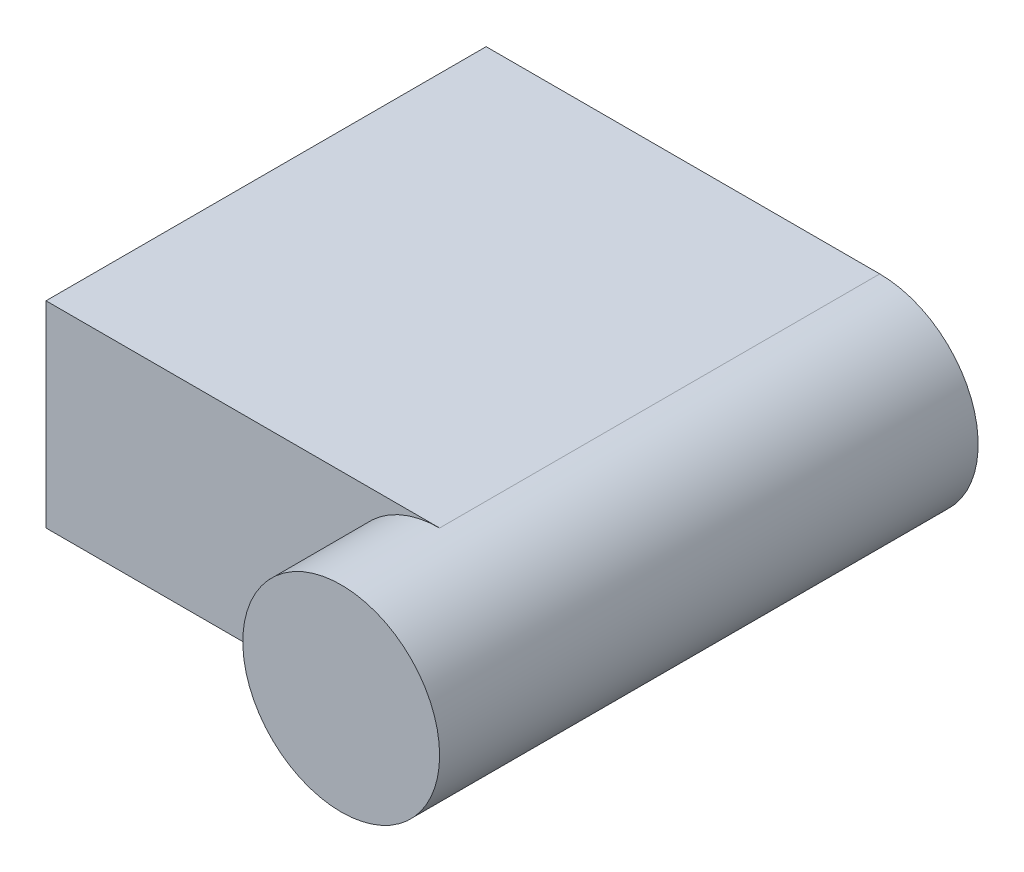
ISO-10303-21;
HEADER;
FILE_DESCRIPTION(('STEP AP214'),'2;1');
FILE_NAME('part.step','',(''),(''),'','','');
FILE_SCHEMA(('AUTOMOTIVE_DESIGN { 1 0 10303 214 1 1 1 1 }'));
ENDSEC;
DATA;
#1=APPLICATION_CONTEXT('core data for automotive mechanical design processes');
#2=APPLICATION_PROTOCOL_DEFINITION('international standard','automotive_design',2000,#1);
#3=PRODUCT_CONTEXT('',#1,'mechanical');
#4=PRODUCT('Part','Part','',(#3));
#5=PRODUCT_RELATED_PRODUCT_CATEGORY('part','',(#4));
#6=PRODUCT_DEFINITION_FORMATION('','',#4);
#7=PRODUCT_DEFINITION_CONTEXT('part definition',#1,'design');
#8=PRODUCT_DEFINITION('design','',#6,#7);
#9=PRODUCT_DEFINITION_SHAPE('','',#8);
#10=(LENGTH_UNIT() NAMED_UNIT(*) SI_UNIT(.MILLI.,.METRE.));
#11=(NAMED_UNIT(*) PLANE_ANGLE_UNIT() SI_UNIT($,.RADIAN.));
#12=(NAMED_UNIT(*) SI_UNIT($,.STERADIAN.) SOLID_ANGLE_UNIT());
#13=UNCERTAINTY_MEASURE_WITH_UNIT(LENGTH_MEASURE(1.E-05),#10,'distance_accuracy_value','');
#14=(GEOMETRIC_REPRESENTATION_CONTEXT(3) GLOBAL_UNCERTAINTY_ASSIGNED_CONTEXT((#13)) GLOBAL_UNIT_ASSIGNED_CONTEXT((#10,
#11,#12)) REPRESENTATION_CONTEXT('',''));
#15=CARTESIAN_POINT('',(0.,0.,0.));
#16=DIRECTION('',(0.,0.,1.));
#17=DIRECTION('',(1.,0.,0.));
#18=AXIS2_PLACEMENT_3D('',#15,#16,#17);
#19=CARTESIAN_POINT('',(0.,0.,44.73));
#20=DIRECTION('',(0.,1.,0.));
#21=DIRECTION('',(0.,0.,1.));
#22=AXIS2_PLACEMENT_3D('',#19,#20,#21);
#23=PLANE('',#22);
#24=DIRECTION('',(0.,0.,1.));
#25=VECTOR('',#24,1.);
#26=CARTESIAN_POINT('',(40.,0.,-63.2455532033676));
#27=LINE('',#26,#25);
#28=CARTESIAN_POINT('',(40.,0.,0.));
#29=VERTEX_POINT('',#28);
#30=CARTESIAN_POINT('',(40.,0.,44.73));
#31=VERTEX_POINT('',#30);
#32=EDGE_CURVE('E93',#29,#31,#27,.T.);
#33=ORIENTED_EDGE('',*,*,#32,.T.);
#34=DIRECTION('',(1.,0.,0.));
#35=VECTOR('',#34,1.);
#36=CARTESIAN_POINT('',(0.,0.,44.73));
#37=LINE('',#36,#35);
#38=CARTESIAN_POINT('',(0.,0.,44.73));
#39=VERTEX_POINT('',#38);
#40=EDGE_CURVE('E91',#39,#31,#37,.T.);
#41=ORIENTED_EDGE('',*,*,#40,.F.);
#42=DIRECTION('',(0.,0.,-1.));
#43=VECTOR('',#42,1.);
#44=CARTESIAN_POINT('',(0.,0.,44.73));
#45=LINE('',#44,#43);
#46=CARTESIAN_POINT('',(0.,0.,0.));
#47=VERTEX_POINT('',#46);
#48=EDGE_CURVE('E11',#39,#47,#45,.T.);
#49=ORIENTED_EDGE('',*,*,#48,.T.);
#50=DIRECTION('',(1.,0.,0.));
#51=VECTOR('',#50,1.);
#52=CARTESIAN_POINT('',(0.,0.,0.));
#53=LINE('',#52,#51);
#54=EDGE_CURVE('E74',#47,#29,#53,.T.);
#55=ORIENTED_EDGE('',*,*,#54,.T.);
#56=EDGE_LOOP('',(#33,#41,#49,#55));
#57=FACE_BOUND('',#56,.T.);
#58=ADVANCED_FACE('F44',(#57),#23,.F.);
#59=CARTESIAN_POINT('',(0.,0.,44.73));
#60=DIRECTION('',(0.,0.,1.));
#61=DIRECTION('',(1.,0.,0.));
#62=AXIS2_PLACEMENT_3D('',#59,#60,#61);
#63=PLANE('',#62);
#64=CARTESIAN_POINT('',(40.,10.,44.73));
#65=DIRECTION('',(0.,0.,1.));
#66=DIRECTION('',(1.,0.,0.));
#67=AXIS2_PLACEMENT_3D('',#64,#65,#66);
#68=CIRCLE('',#67,9.99999999999999);
#69=CARTESIAN_POINT('',(40.,20.,44.73));
#70=VERTEX_POINT('',#69);
#71=EDGE_CURVE('E96',#70,#31,#68,.T.);
#72=ORIENTED_EDGE('',*,*,#71,.F.);
#73=DIRECTION('',(-1.,0.,0.));
#74=VECTOR('',#73,1.);
#75=CARTESIAN_POINT('',(100.,20.,44.73));
#76=LINE('',#75,#74);
#77=CARTESIAN_POINT('',(0.,20.,44.73));
#78=VERTEX_POINT('',#77);
#79=EDGE_CURVE('E62',#70,#78,#76,.T.);
#80=ORIENTED_EDGE('',*,*,#79,.T.);
#81=DIRECTION('',(0.,-1.,0.));
#82=VECTOR('',#81,1.);
#83=CARTESIAN_POINT('',(0.,20.,44.73));
#84=LINE('',#83,#82);
#85=EDGE_CURVE('E98',#78,#39,#84,.T.);
#86=ORIENTED_EDGE('',*,*,#85,.T.);
#87=ORIENTED_EDGE('',*,*,#40,.T.);
#88=EDGE_LOOP('',(#72,#80,#86,#87));
#89=FACE_BOUND('',#88,.T.);
#90=ADVANCED_FACE('F92',(#89),#63,.T.);
#91=CARTESIAN_POINT('',(0.,20.,44.73));
#92=DIRECTION('',(1.,0.,0.));
#93=DIRECTION('',(0.,1.,0.));
#94=AXIS2_PLACEMENT_3D('',#91,#92,#93);
#95=PLANE('',#94);
#96=DIRECTION('',(0.,-1.,0.));
#97=VECTOR('',#96,1.);
#98=CARTESIAN_POINT('',(0.,20.,0.));
#99=LINE('',#98,#97);
#100=CARTESIAN_POINT('',(0.,20.,0.));
#101=VERTEX_POINT('',#100);
#102=EDGE_CURVE('E106',#101,#47,#99,.T.);
#103=ORIENTED_EDGE('',*,*,#102,.T.);
#104=ORIENTED_EDGE('',*,*,#48,.F.);
#105=ORIENTED_EDGE('',*,*,#85,.F.);
#106=DIRECTION('',(0.,0.,-1.));
#107=VECTOR('',#106,1.);
#108=CARTESIAN_POINT('',(0.,20.,44.73));
#109=LINE('',#108,#107);
#110=EDGE_CURVE('E53',#78,#101,#109,.T.);
#111=ORIENTED_EDGE('',*,*,#110,.T.);
#112=EDGE_LOOP('',(#103,#104,#105,#111));
#113=FACE_BOUND('',#112,.T.);
#114=ADVANCED_FACE('F50',(#113),#95,.F.);
#115=CARTESIAN_POINT('',(100.,20.,44.73));
#116=DIRECTION('',(0.,-1.,0.));
#117=DIRECTION('',(1.,0.,0.));
#118=AXIS2_PLACEMENT_3D('',#115,#116,#117);
#119=PLANE('',#118);
#120=ORIENTED_EDGE('',*,*,#79,.F.);
#121=DIRECTION('',(0.,0.,1.));
#122=VECTOR('',#121,1.);
#123=CARTESIAN_POINT('',(40.,20.,-63.2455532033676));
#124=LINE('',#123,#122);
#125=CARTESIAN_POINT('',(40.,20.,0.));
#126=VERTEX_POINT('',#125);
#127=EDGE_CURVE('E85',#126,#70,#124,.T.);
#128=ORIENTED_EDGE('',*,*,#127,.F.);
#129=DIRECTION('',(-1.,0.,0.));
#130=VECTOR('',#129,1.);
#131=CARTESIAN_POINT('',(100.,20.,0.));
#132=LINE('',#131,#130);
#133=EDGE_CURVE('E109',#126,#101,#132,.T.);
#134=ORIENTED_EDGE('',*,*,#133,.T.);
#135=ORIENTED_EDGE('',*,*,#110,.F.);
#136=EDGE_LOOP('',(#120,#128,#134,#135));
#137=FACE_BOUND('',#136,.T.);
#138=ADVANCED_FACE('F122',(#137),#119,.F.);
#139=CARTESIAN_POINT('',(0.,0.,0.));
#140=DIRECTION('',(0.,0.,1.));
#141=DIRECTION('',(1.,0.,0.));
#142=AXIS2_PLACEMENT_3D('',#139,#140,#141);
#143=PLANE('',#142);
#144=ORIENTED_EDGE('',*,*,#133,.F.);
#145=CARTESIAN_POINT('',(40.,10.,0.));
#146=DIRECTION('',(0.,0.,1.));
#147=DIRECTION('',(1.,0.,0.));
#148=AXIS2_PLACEMENT_3D('',#145,#146,#147);
#149=CIRCLE('',#148,10.);
#150=EDGE_CURVE('E103',#29,#126,#149,.T.);
#151=ORIENTED_EDGE('',*,*,#150,.F.);
#152=ORIENTED_EDGE('',*,*,#54,.F.);
#153=ORIENTED_EDGE('',*,*,#102,.F.);
#154=EDGE_LOOP('',(#144,#151,#152,#153));
#155=FACE_BOUND('',#154,.T.);
#156=ADVANCED_FACE('F120',(#155),#143,.F.);
#157=CARTESIAN_POINT('',(40.,10.,54.73));
#158=DIRECTION('',(0.,0.,-1.));
#159=DIRECTION('',(-1.,0.,0.));
#160=AXIS2_PLACEMENT_3D('',#157,#158,#159);
#161=CYLINDRICAL_SURFACE('',#160,9.99999999999999);
#162=CARTESIAN_POINT('',(40.,10.,54.73));
#163=DIRECTION('',(0.,0.,1.));
#164=DIRECTION('',(1.,0.,0.));
#165=AXIS2_PLACEMENT_3D('',#162,#163,#164);
#166=CIRCLE('',#165,9.99999999999999);
#167=CARTESIAN_POINT('',(50.,10.,54.73));
#168=VERTEX_POINT('',#167);
#169=EDGE_CURVE('E105',#168,#168,#166,.T.);
#170=ORIENTED_EDGE('',*,*,#169,.F.);
#171=EDGE_LOOP('',(#170));
#172=FACE_BOUND('',#171,.T.);
#173=ORIENTED_EDGE('',*,*,#71,.T.);
#174=ORIENTED_EDGE('',*,*,#32,.F.);
#175=ORIENTED_EDGE('',*,*,#150,.T.);
#176=ORIENTED_EDGE('',*,*,#127,.T.);
#177=EDGE_LOOP('',(#173,#174,#175,#176));
#178=FACE_BOUND('',#177,.T.);
#179=ADVANCED_FACE('F101',(#172,#178),#161,.T.);
#180=CARTESIAN_POINT('',(0.,0.,54.73));
#181=DIRECTION('',(0.,0.,1.));
#182=DIRECTION('',(1.,0.,0.));
#183=AXIS2_PLACEMENT_3D('',#180,#181,#182);
#184=PLANE('',#183);
#185=ORIENTED_EDGE('',*,*,#169,.T.);
#186=EDGE_LOOP('',(#185));
#187=FACE_BOUND('',#186,.T.);
#188=ADVANCED_FACE('F143',(#187),#184,.T.);
#189=CLOSED_SHELL('',(#58,#90,#114,#138,#156,#179,#188));
#190=MANIFOLD_SOLID_BREP('B2',#189);
#191=ADVANCED_BREP_SHAPE_REPRESENTATION('',(#18,#190),#14);
#192=SHAPE_DEFINITION_REPRESENTATION(#9,#191);
ENDSEC;
END-ISO-10303-21;
